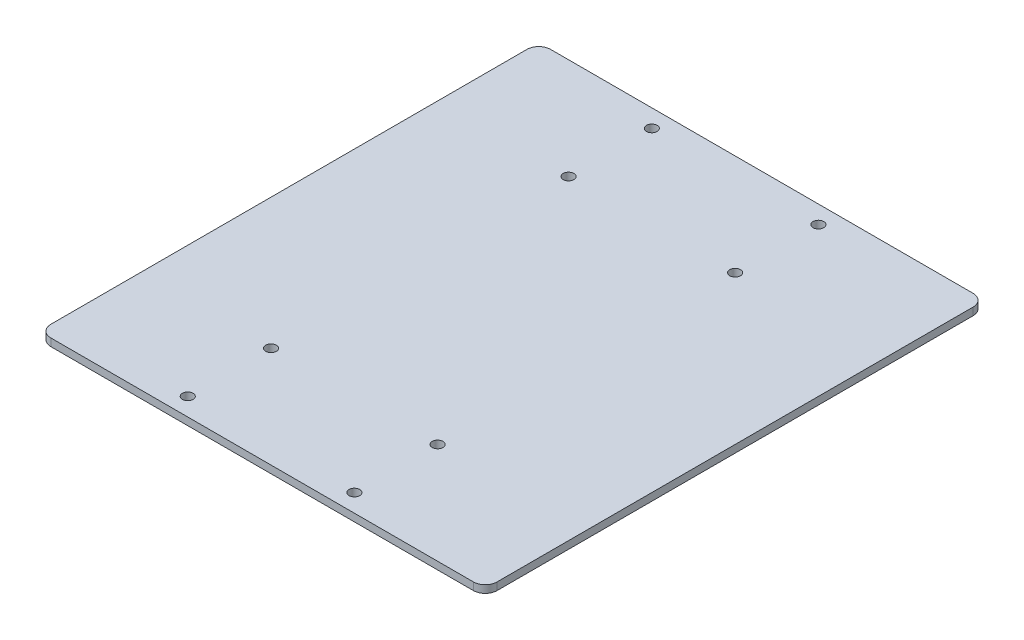
ISO-10303-21;
HEADER;
FILE_DESCRIPTION(('STEP AP214'),'2;1');
FILE_NAME('part.step','',(''),(''),'','','');
FILE_SCHEMA(('AUTOMOTIVE_DESIGN { 1 0 10303 214 1 1 1 1 }'));
ENDSEC;
DATA;
#1=APPLICATION_CONTEXT('core data for automotive mechanical design processes');
#2=APPLICATION_PROTOCOL_DEFINITION('international standard','automotive_design',2000,#1);
#3=PRODUCT_CONTEXT('',#1,'mechanical');
#4=PRODUCT('Part','Part','',(#3));
#5=PRODUCT_RELATED_PRODUCT_CATEGORY('part','',(#4));
#6=PRODUCT_DEFINITION_FORMATION('','',#4);
#7=PRODUCT_DEFINITION_CONTEXT('part definition',#1,'design');
#8=PRODUCT_DEFINITION('design','',#6,#7);
#9=PRODUCT_DEFINITION_SHAPE('','',#8);
#10=(LENGTH_UNIT() NAMED_UNIT(*) SI_UNIT(.MILLI.,.METRE.));
#11=(NAMED_UNIT(*) PLANE_ANGLE_UNIT() SI_UNIT($,.RADIAN.));
#12=(NAMED_UNIT(*) SI_UNIT($,.STERADIAN.) SOLID_ANGLE_UNIT());
#13=UNCERTAINTY_MEASURE_WITH_UNIT(LENGTH_MEASURE(1.E-05),#10,'distance_accuracy_value','');
#14=(GEOMETRIC_REPRESENTATION_CONTEXT(3) GLOBAL_UNCERTAINTY_ASSIGNED_CONTEXT((#13)) GLOBAL_UNIT_ASSIGNED_CONTEXT((#10,
#11,#12)) REPRESENTATION_CONTEXT('',''));
#15=CARTESIAN_POINT('',(0.,0.,0.));
#16=DIRECTION('',(0.,0.,1.));
#17=DIRECTION('',(1.,0.,0.));
#18=AXIS2_PLACEMENT_3D('',#15,#16,#17);
#19=CARTESIAN_POINT('',(0.,0.,0.));
#20=DIRECTION('',(0.,-1.,0.));
#21=DIRECTION('',(0.,0.,-1.));
#22=AXIS2_PLACEMENT_3D('',#19,#20,#21);
#23=PLANE('',#22);
#24=CARTESIAN_POINT('',(62.4999999999999,0.,-125.));
#25=DIRECTION('',(0.,1.,0.));
#26=DIRECTION('',(0.,0.,1.));
#27=AXIS2_PLACEMENT_3D('',#24,#25,#26);
#28=CIRCLE('',#27,4.5);
#29=CARTESIAN_POINT('',(62.4999999999999,0.,-120.5));
#30=VERTEX_POINT('',#29);
#31=EDGE_CURVE('E216',#30,#30,#28,.T.);
#32=ORIENTED_EDGE('',*,*,#31,.T.);
#33=EDGE_LOOP('',(#32));
#34=FACE_BOUND('',#33,.T.);
#35=CARTESIAN_POINT('',(62.4999999999999,0.,-195.));
#36=DIRECTION('',(0.,1.,0.));
#37=DIRECTION('',(0.,0.,1.));
#38=AXIS2_PLACEMENT_3D('',#35,#36,#37);
#39=CIRCLE('',#38,4.5);
#40=CARTESIAN_POINT('',(62.4999999999999,0.,-190.5));
#41=VERTEX_POINT('',#40);
#42=EDGE_CURVE('E204',#41,#41,#39,.T.);
#43=ORIENTED_EDGE('',*,*,#42,.T.);
#44=EDGE_LOOP('',(#43));
#45=FACE_BOUND('',#44,.T.);
#46=CARTESIAN_POINT('',(-77.5000000000001,0.,195.));
#47=DIRECTION('',(0.,1.,0.));
#48=DIRECTION('',(0.,0.,1.));
#49=AXIS2_PLACEMENT_3D('',#46,#47,#48);
#50=CIRCLE('',#49,4.5);
#51=CARTESIAN_POINT('',(-77.5000000000001,0.,199.5));
#52=VERTEX_POINT('',#51);
#53=EDGE_CURVE('E198',#52,#52,#50,.T.);
#54=ORIENTED_EDGE('',*,*,#53,.T.);
#55=EDGE_LOOP('',(#54));
#56=FACE_BOUND('',#55,.T.);
#57=CARTESIAN_POINT('',(62.4999999999999,0.,125.));
#58=DIRECTION('',(0.,1.,0.));
#59=DIRECTION('',(0.,0.,1.));
#60=AXIS2_PLACEMENT_3D('',#57,#58,#59);
#61=CIRCLE('',#60,4.5);
#62=CARTESIAN_POINT('',(62.4999999999999,0.,129.5));
#63=VERTEX_POINT('',#62);
#64=EDGE_CURVE('E192',#63,#63,#61,.T.);
#65=ORIENTED_EDGE('',*,*,#64,.T.);
#66=EDGE_LOOP('',(#65));
#67=FACE_BOUND('',#66,.T.);
#68=CARTESIAN_POINT('',(-77.5000000000001,0.,125.));
#69=DIRECTION('',(0.,1.,0.));
#70=DIRECTION('',(0.,0.,1.));
#71=AXIS2_PLACEMENT_3D('',#68,#69,#70);
#72=CIRCLE('',#71,4.5);
#73=CARTESIAN_POINT('',(-77.5000000000001,0.,129.5));
#74=VERTEX_POINT('',#73);
#75=EDGE_CURVE('E183',#74,#74,#72,.T.);
#76=ORIENTED_EDGE('',*,*,#75,.T.);
#77=EDGE_LOOP('',(#76));
#78=FACE_BOUND('',#77,.T.);
#79=CARTESIAN_POINT('',(62.4999999999999,0.,195.));
#80=DIRECTION('',(0.,1.,0.));
#81=DIRECTION('',(0.,0.,1.));
#82=AXIS2_PLACEMENT_3D('',#79,#80,#81);
#83=CIRCLE('',#82,4.5);
#84=CARTESIAN_POINT('',(62.4999999999999,0.,199.5));
#85=VERTEX_POINT('',#84);
#86=EDGE_CURVE('E174',#85,#85,#83,.T.);
#87=ORIENTED_EDGE('',*,*,#86,.T.);
#88=EDGE_LOOP('',(#87));
#89=FACE_BOUND('',#88,.T.);
#90=DIRECTION('',(0.,0.,1.));
#91=VECTOR('',#90,1.);
#92=CARTESIAN_POINT('',(-187.5,0.,210.));
#93=LINE('',#92,#91);
#94=CARTESIAN_POINT('',(-187.5,0.,-200.));
#95=VERTEX_POINT('',#94);
#96=CARTESIAN_POINT('',(-187.5,0.,200.));
#97=VERTEX_POINT('',#96);
#98=EDGE_CURVE('E116',#95,#97,#93,.T.);
#99=ORIENTED_EDGE('',*,*,#98,.F.);
#100=CARTESIAN_POINT('',(-177.5,0.,-200.));
#101=DIRECTION('',(0.,-1.,0.));
#102=DIRECTION('',(0.,0.,-1.));
#103=AXIS2_PLACEMENT_3D('',#100,#101,#102);
#104=CIRCLE('',#103,10.);
#105=CARTESIAN_POINT('',(-177.5,0.,-210.));
#106=VERTEX_POINT('',#105);
#107=EDGE_CURVE('E99',#95,#106,#104,.T.);
#108=ORIENTED_EDGE('',*,*,#107,.T.);
#109=DIRECTION('',(-1.,0.,0.));
#110=VECTOR('',#109,1.);
#111=CARTESIAN_POINT('',(-187.5,0.,-210.));
#112=LINE('',#111,#110);
#113=CARTESIAN_POINT('',(177.5,0.,-210.));
#114=VERTEX_POINT('',#113);
#115=EDGE_CURVE('E125',#114,#106,#112,.T.);
#116=ORIENTED_EDGE('',*,*,#115,.F.);
#117=CARTESIAN_POINT('',(177.5,0.,-200.));
#118=DIRECTION('',(0.,-1.,0.));
#119=DIRECTION('',(0.,0.,-1.));
#120=AXIS2_PLACEMENT_3D('',#117,#118,#119);
#121=CIRCLE('',#120,10.);
#122=CARTESIAN_POINT('',(187.5,0.,-200.));
#123=VERTEX_POINT('',#122);
#124=EDGE_CURVE('E110',#114,#123,#121,.T.);
#125=ORIENTED_EDGE('',*,*,#124,.T.);
#126=DIRECTION('',(0.,0.,-1.));
#127=VECTOR('',#126,1.);
#128=CARTESIAN_POINT('',(187.5,0.,210.));
#129=LINE('',#128,#127);
#130=CARTESIAN_POINT('',(187.5,0.,200.));
#131=VERTEX_POINT('',#130);
#132=EDGE_CURVE('E129',#131,#123,#129,.T.);
#133=ORIENTED_EDGE('',*,*,#132,.F.);
#134=CARTESIAN_POINT('',(177.5,0.,200.));
#135=DIRECTION('',(0.,-1.,0.));
#136=DIRECTION('',(0.,0.,-1.));
#137=AXIS2_PLACEMENT_3D('',#134,#135,#136);
#138=CIRCLE('',#137,10.);
#139=CARTESIAN_POINT('',(177.5,0.,210.));
#140=VERTEX_POINT('',#139);
#141=EDGE_CURVE('E136',#131,#140,#138,.T.);
#142=ORIENTED_EDGE('',*,*,#141,.T.);
#143=DIRECTION('',(1.,0.,0.));
#144=VECTOR('',#143,1.);
#145=CARTESIAN_POINT('',(-187.5,0.,210.));
#146=LINE('',#145,#144);
#147=CARTESIAN_POINT('',(-177.5,0.,210.));
#148=VERTEX_POINT('',#147);
#149=EDGE_CURVE('E124',#148,#140,#146,.T.);
#150=ORIENTED_EDGE('',*,*,#149,.F.);
#151=CARTESIAN_POINT('',(-177.5,0.,200.));
#152=DIRECTION('',(0.,-1.,0.));
#153=DIRECTION('',(0.,0.,-1.));
#154=AXIS2_PLACEMENT_3D('',#151,#152,#153);
#155=CIRCLE('',#154,10.);
#156=EDGE_CURVE('E119',#148,#97,#155,.T.);
#157=ORIENTED_EDGE('',*,*,#156,.T.);
#158=EDGE_LOOP('',(#99,#108,#116,#125,#133,#142,#150,#157));
#159=FACE_BOUND('',#158,.T.);
#160=CARTESIAN_POINT('',(-77.5000000000001,0.,-125.));
#161=DIRECTION('',(0.,1.,0.));
#162=DIRECTION('',(0.,0.,1.));
#163=AXIS2_PLACEMENT_3D('',#160,#161,#162);
#164=CIRCLE('',#163,4.5);
#165=CARTESIAN_POINT('',(-77.5000000000001,0.,-120.5));
#166=VERTEX_POINT('',#165);
#167=EDGE_CURVE('E210',#166,#166,#164,.T.);
#168=ORIENTED_EDGE('',*,*,#167,.T.);
#169=EDGE_LOOP('',(#168));
#170=FACE_BOUND('',#169,.T.);
#171=CARTESIAN_POINT('',(-77.5000000000001,0.,-195.));
#172=DIRECTION('',(0.,1.,0.));
#173=DIRECTION('',(0.,0.,1.));
#174=AXIS2_PLACEMENT_3D('',#171,#172,#173);
#175=CIRCLE('',#174,4.5);
#176=CARTESIAN_POINT('',(-77.5000000000001,0.,-190.5));
#177=VERTEX_POINT('',#176);
#178=EDGE_CURVE('E222',#177,#177,#175,.T.);
#179=ORIENTED_EDGE('',*,*,#178,.T.);
#180=EDGE_LOOP('',(#179));
#181=FACE_BOUND('',#180,.T.);
#182=ADVANCED_FACE('F34',(#34,#45,#56,#67,#78,#89,#159,#170,#181),#23,.T.);
#183=CARTESIAN_POINT('',(0.,6.35,0.));
#184=DIRECTION('',(0.,-1.,0.));
#185=DIRECTION('',(0.,0.,-1.));
#186=AXIS2_PLACEMENT_3D('',#183,#184,#185);
#187=PLANE('',#186);
#188=CARTESIAN_POINT('',(62.4999999999999,6.35,-195.));
#189=DIRECTION('',(0.,1.,0.));
#190=DIRECTION('',(0.,0.,1.));
#191=AXIS2_PLACEMENT_3D('',#188,#189,#190);
#192=CIRCLE('',#191,4.49999999999999);
#193=CARTESIAN_POINT('',(62.4999999999999,6.35,-190.5));
#194=VERTEX_POINT('',#193);
#195=EDGE_CURVE('E207',#194,#194,#192,.T.);
#196=ORIENTED_EDGE('',*,*,#195,.F.);
#197=EDGE_LOOP('',(#196));
#198=FACE_BOUND('',#197,.T.);
#199=CARTESIAN_POINT('',(-77.5000000000001,6.35,195.));
#200=DIRECTION('',(0.,1.,0.));
#201=DIRECTION('',(0.,0.,1.));
#202=AXIS2_PLACEMENT_3D('',#199,#200,#201);
#203=CIRCLE('',#202,4.49999999999999);
#204=CARTESIAN_POINT('',(-77.5000000000001,6.35,199.5));
#205=VERTEX_POINT('',#204);
#206=EDGE_CURVE('E201',#205,#205,#203,.T.);
#207=ORIENTED_EDGE('',*,*,#206,.F.);
#208=EDGE_LOOP('',(#207));
#209=FACE_BOUND('',#208,.T.);
#210=CARTESIAN_POINT('',(62.4999999999999,6.35,125.));
#211=DIRECTION('',(0.,1.,0.));
#212=DIRECTION('',(0.,0.,1.));
#213=AXIS2_PLACEMENT_3D('',#210,#211,#212);
#214=CIRCLE('',#213,4.49999999999999);
#215=CARTESIAN_POINT('',(62.4999999999999,6.35,129.5));
#216=VERTEX_POINT('',#215);
#217=EDGE_CURVE('E195',#216,#216,#214,.T.);
#218=ORIENTED_EDGE('',*,*,#217,.F.);
#219=EDGE_LOOP('',(#218));
#220=FACE_BOUND('',#219,.T.);
#221=CARTESIAN_POINT('',(-77.5000000000001,6.35,125.));
#222=DIRECTION('',(0.,1.,0.));
#223=DIRECTION('',(0.,0.,1.));
#224=AXIS2_PLACEMENT_3D('',#221,#222,#223);
#225=CIRCLE('',#224,4.49999999999999);
#226=CARTESIAN_POINT('',(-77.5000000000001,6.35,129.5));
#227=VERTEX_POINT('',#226);
#228=EDGE_CURVE('E187',#227,#227,#225,.T.);
#229=ORIENTED_EDGE('',*,*,#228,.F.);
#230=EDGE_LOOP('',(#229));
#231=FACE_BOUND('',#230,.T.);
#232=CARTESIAN_POINT('',(62.4999999999999,6.35,195.));
#233=DIRECTION('',(0.,1.,0.));
#234=DIRECTION('',(0.,0.,1.));
#235=AXIS2_PLACEMENT_3D('',#232,#233,#234);
#236=CIRCLE('',#235,4.49999999999999);
#237=CARTESIAN_POINT('',(62.4999999999999,6.35,199.5));
#238=VERTEX_POINT('',#237);
#239=EDGE_CURVE('E179',#238,#238,#236,.T.);
#240=ORIENTED_EDGE('',*,*,#239,.F.);
#241=EDGE_LOOP('',(#240));
#242=FACE_BOUND('',#241,.T.);
#243=DIRECTION('',(-1.,0.,0.));
#244=VECTOR('',#243,1.);
#245=CARTESIAN_POINT('',(-187.5,6.35,-210.));
#246=LINE('',#245,#244);
#247=CARTESIAN_POINT('',(177.5,6.35,-210.));
#248=VERTEX_POINT('',#247);
#249=CARTESIAN_POINT('',(-177.5,6.35,-210.));
#250=VERTEX_POINT('',#249);
#251=EDGE_CURVE('E169',#248,#250,#246,.T.);
#252=ORIENTED_EDGE('',*,*,#251,.T.);
#253=CARTESIAN_POINT('',(-177.5,6.35,-200.));
#254=DIRECTION('',(0.,-1.,0.));
#255=DIRECTION('',(0.,0.,-1.));
#256=AXIS2_PLACEMENT_3D('',#253,#254,#255);
#257=CIRCLE('',#256,10.);
#258=CARTESIAN_POINT('',(-187.5,6.35,-200.));
#259=VERTEX_POINT('',#258);
#260=EDGE_CURVE('E147',#250,#259,#257,.F.);
#261=ORIENTED_EDGE('',*,*,#260,.T.);
#262=DIRECTION('',(0.,0.,1.));
#263=VECTOR('',#262,1.);
#264=CARTESIAN_POINT('',(-187.5,6.35,210.));
#265=LINE('',#264,#263);
#266=CARTESIAN_POINT('',(-187.5,6.35,200.));
#267=VERTEX_POINT('',#266);
#268=EDGE_CURVE('E118',#259,#267,#265,.T.);
#269=ORIENTED_EDGE('',*,*,#268,.T.);
#270=CARTESIAN_POINT('',(-177.5,6.35,200.));
#271=DIRECTION('',(0.,-1.,0.));
#272=DIRECTION('',(0.,0.,-1.));
#273=AXIS2_PLACEMENT_3D('',#270,#271,#272);
#274=CIRCLE('',#273,10.);
#275=CARTESIAN_POINT('',(-177.5,6.35,210.));
#276=VERTEX_POINT('',#275);
#277=EDGE_CURVE('E54',#267,#276,#274,.F.);
#278=ORIENTED_EDGE('',*,*,#277,.T.);
#279=DIRECTION('',(1.,0.,0.));
#280=VECTOR('',#279,1.);
#281=CARTESIAN_POINT('',(-187.5,6.35,210.));
#282=LINE('',#281,#280);
#283=CARTESIAN_POINT('',(177.5,6.35,210.));
#284=VERTEX_POINT('',#283);
#285=EDGE_CURVE('E133',#276,#284,#282,.T.);
#286=ORIENTED_EDGE('',*,*,#285,.T.);
#287=CARTESIAN_POINT('',(177.5,6.35,200.));
#288=DIRECTION('',(0.,-1.,0.));
#289=DIRECTION('',(0.,0.,-1.));
#290=AXIS2_PLACEMENT_3D('',#287,#288,#289);
#291=CIRCLE('',#290,10.);
#292=CARTESIAN_POINT('',(187.5,6.35,200.));
#293=VERTEX_POINT('',#292);
#294=EDGE_CURVE('E143',#284,#293,#291,.F.);
#295=ORIENTED_EDGE('',*,*,#294,.T.);
#296=DIRECTION('',(0.,0.,-1.));
#297=VECTOR('',#296,1.);
#298=CARTESIAN_POINT('',(187.5,6.35,210.));
#299=LINE('',#298,#297);
#300=CARTESIAN_POINT('',(187.5,6.35,-200.));
#301=VERTEX_POINT('',#300);
#302=EDGE_CURVE('E127',#293,#301,#299,.T.);
#303=ORIENTED_EDGE('',*,*,#302,.T.);
#304=CARTESIAN_POINT('',(177.5,6.35,-200.));
#305=DIRECTION('',(0.,-1.,0.));
#306=DIRECTION('',(0.,0.,-1.));
#307=AXIS2_PLACEMENT_3D('',#304,#305,#306);
#308=CIRCLE('',#307,10.);
#309=EDGE_CURVE('E145',#301,#248,#308,.F.);
#310=ORIENTED_EDGE('',*,*,#309,.T.);
#311=EDGE_LOOP('',(#252,#261,#269,#278,#286,#295,#303,#310));
#312=FACE_BOUND('',#311,.T.);
#313=CARTESIAN_POINT('',(-77.5000000000001,6.35,-125.));
#314=DIRECTION('',(0.,1.,0.));
#315=DIRECTION('',(0.,0.,1.));
#316=AXIS2_PLACEMENT_3D('',#313,#314,#315);
#317=CIRCLE('',#316,4.49999999999999);
#318=CARTESIAN_POINT('',(-77.5000000000001,6.35,-120.5));
#319=VERTEX_POINT('',#318);
#320=EDGE_CURVE('E213',#319,#319,#317,.T.);
#321=ORIENTED_EDGE('',*,*,#320,.F.);
#322=EDGE_LOOP('',(#321));
#323=FACE_BOUND('',#322,.T.);
#324=CARTESIAN_POINT('',(62.4999999999999,6.35,-125.));
#325=DIRECTION('',(0.,1.,0.));
#326=DIRECTION('',(0.,0.,1.));
#327=AXIS2_PLACEMENT_3D('',#324,#325,#326);
#328=CIRCLE('',#327,4.49999999999999);
#329=CARTESIAN_POINT('',(62.4999999999999,6.35,-120.5));
#330=VERTEX_POINT('',#329);
#331=EDGE_CURVE('E219',#330,#330,#328,.T.);
#332=ORIENTED_EDGE('',*,*,#331,.F.);
#333=EDGE_LOOP('',(#332));
#334=FACE_BOUND('',#333,.T.);
#335=CARTESIAN_POINT('',(-77.5000000000001,6.35,-195.));
#336=DIRECTION('',(0.,1.,0.));
#337=DIRECTION('',(0.,0.,1.));
#338=AXIS2_PLACEMENT_3D('',#335,#336,#337);
#339=CIRCLE('',#338,4.49999999999999);
#340=CARTESIAN_POINT('',(-77.5000000000001,6.35,-190.5));
#341=VERTEX_POINT('',#340);
#342=EDGE_CURVE('E225',#341,#341,#339,.T.);
#343=ORIENTED_EDGE('',*,*,#342,.F.);
#344=EDGE_LOOP('',(#343));
#345=FACE_BOUND('',#344,.T.);
#346=ADVANCED_FACE('F231',(#198,#209,#220,#231,#242,#312,#323,#334,#345),#187,.F.);
#347=CARTESIAN_POINT('',(187.5,6.35,210.));
#348=DIRECTION('',(-1.,0.,0.));
#349=DIRECTION('',(0.,0.,1.));
#350=AXIS2_PLACEMENT_3D('',#347,#348,#349);
#351=PLANE('',#350);
#352=ORIENTED_EDGE('',*,*,#132,.T.);
#353=DIRECTION('',(0.,-1.,0.));
#354=VECTOR('',#353,1.);
#355=CARTESIAN_POINT('',(187.5,6.35,-200.));
#356=LINE('',#355,#354);
#357=EDGE_CURVE('E152',#123,#301,#356,.F.);
#358=ORIENTED_EDGE('',*,*,#357,.T.);
#359=ORIENTED_EDGE('',*,*,#302,.F.);
#360=DIRECTION('',(0.,-1.,0.));
#361=VECTOR('',#360,1.);
#362=CARTESIAN_POINT('',(187.5,6.35,200.));
#363=LINE('',#362,#361);
#364=EDGE_CURVE('E149',#293,#131,#363,.T.);
#365=ORIENTED_EDGE('',*,*,#364,.T.);
#366=EDGE_LOOP('',(#352,#358,#359,#365));
#367=FACE_BOUND('',#366,.T.);
#368=ADVANCED_FACE('F165',(#367),#351,.F.);
#369=CARTESIAN_POINT('',(-187.5,6.35,-210.));
#370=DIRECTION('',(0.,0.,1.));
#371=DIRECTION('',(1.,0.,0.));
#372=AXIS2_PLACEMENT_3D('',#369,#370,#371);
#373=PLANE('',#372);
#374=ORIENTED_EDGE('',*,*,#115,.T.);
#375=DIRECTION('',(0.,-1.,0.));
#376=VECTOR('',#375,1.);
#377=CARTESIAN_POINT('',(-177.5,6.35,-210.));
#378=LINE('',#377,#376);
#379=EDGE_CURVE('E104',#106,#250,#378,.F.);
#380=ORIENTED_EDGE('',*,*,#379,.T.);
#381=ORIENTED_EDGE('',*,*,#251,.F.);
#382=DIRECTION('',(0.,-1.,0.));
#383=VECTOR('',#382,1.);
#384=CARTESIAN_POINT('',(177.5,6.35,-210.));
#385=LINE('',#384,#383);
#386=EDGE_CURVE('E109',#248,#114,#385,.T.);
#387=ORIENTED_EDGE('',*,*,#386,.T.);
#388=EDGE_LOOP('',(#374,#380,#381,#387));
#389=FACE_BOUND('',#388,.T.);
#390=ADVANCED_FACE('F239',(#389),#373,.F.);
#391=CARTESIAN_POINT('',(-187.5,6.35,210.));
#392=DIRECTION('',(1.,0.,0.));
#393=DIRECTION('',(0.,0.,-1.));
#394=AXIS2_PLACEMENT_3D('',#391,#392,#393);
#395=PLANE('',#394);
#396=ORIENTED_EDGE('',*,*,#268,.F.);
#397=DIRECTION('',(0.,-1.,0.));
#398=VECTOR('',#397,1.);
#399=CARTESIAN_POINT('',(-187.5,6.35,-200.));
#400=LINE('',#399,#398);
#401=EDGE_CURVE('E103',#259,#95,#400,.T.);
#402=ORIENTED_EDGE('',*,*,#401,.T.);
#403=ORIENTED_EDGE('',*,*,#98,.T.);
#404=DIRECTION('',(0.,-1.,0.));
#405=VECTOR('',#404,1.);
#406=CARTESIAN_POINT('',(-187.5,6.35,200.));
#407=LINE('',#406,#405);
#408=EDGE_CURVE('E120',#97,#267,#407,.F.);
#409=ORIENTED_EDGE('',*,*,#408,.T.);
#410=EDGE_LOOP('',(#396,#402,#403,#409));
#411=FACE_BOUND('',#410,.T.);
#412=ADVANCED_FACE('F115',(#411),#395,.F.);
#413=CARTESIAN_POINT('',(-187.5,6.35,210.));
#414=DIRECTION('',(0.,0.,-1.));
#415=DIRECTION('',(-1.,0.,0.));
#416=AXIS2_PLACEMENT_3D('',#413,#414,#415);
#417=PLANE('',#416);
#418=ORIENTED_EDGE('',*,*,#149,.T.);
#419=DIRECTION('',(0.,-1.,0.));
#420=VECTOR('',#419,1.);
#421=CARTESIAN_POINT('',(177.5,6.35,210.));
#422=LINE('',#421,#420);
#423=EDGE_CURVE('E11',#140,#284,#422,.F.);
#424=ORIENTED_EDGE('',*,*,#423,.T.);
#425=ORIENTED_EDGE('',*,*,#285,.F.);
#426=DIRECTION('',(0.,-1.,0.));
#427=VECTOR('',#426,1.);
#428=CARTESIAN_POINT('',(-177.5,6.35,210.));
#429=LINE('',#428,#427);
#430=EDGE_CURVE('E42',#276,#148,#429,.T.);
#431=ORIENTED_EDGE('',*,*,#430,.T.);
#432=EDGE_LOOP('',(#418,#424,#425,#431));
#433=FACE_BOUND('',#432,.T.);
#434=ADVANCED_FACE('F155',(#433),#417,.F.);
#435=CARTESIAN_POINT('',(-177.5,6.35,-200.));
#436=DIRECTION('',(0.,-1.,0.));
#437=DIRECTION('',(0.,0.,-1.));
#438=AXIS2_PLACEMENT_3D('',#435,#436,#437);
#439=CYLINDRICAL_SURFACE('',#438,10.);
#440=ORIENTED_EDGE('',*,*,#260,.F.);
#441=ORIENTED_EDGE('',*,*,#379,.F.);
#442=ORIENTED_EDGE('',*,*,#107,.F.);
#443=ORIENTED_EDGE('',*,*,#401,.F.);
#444=EDGE_LOOP('',(#440,#441,#442,#443));
#445=FACE_BOUND('',#444,.T.);
#446=ADVANCED_FACE('F102',(#445),#439,.T.);
#447=CARTESIAN_POINT('',(177.5,6.35,-200.));
#448=DIRECTION('',(0.,-1.,0.));
#449=DIRECTION('',(0.,0.,-1.));
#450=AXIS2_PLACEMENT_3D('',#447,#448,#449);
#451=CYLINDRICAL_SURFACE('',#450,10.);
#452=ORIENTED_EDGE('',*,*,#309,.F.);
#453=ORIENTED_EDGE('',*,*,#357,.F.);
#454=ORIENTED_EDGE('',*,*,#124,.F.);
#455=ORIENTED_EDGE('',*,*,#386,.F.);
#456=EDGE_LOOP('',(#452,#453,#454,#455));
#457=FACE_BOUND('',#456,.T.);
#458=ADVANCED_FACE('F258',(#457),#451,.T.);
#459=CARTESIAN_POINT('',(177.5,6.35,200.));
#460=DIRECTION('',(0.,-1.,0.));
#461=DIRECTION('',(0.,0.,-1.));
#462=AXIS2_PLACEMENT_3D('',#459,#460,#461);
#463=CYLINDRICAL_SURFACE('',#462,10.);
#464=ORIENTED_EDGE('',*,*,#294,.F.);
#465=ORIENTED_EDGE('',*,*,#423,.F.);
#466=ORIENTED_EDGE('',*,*,#141,.F.);
#467=ORIENTED_EDGE('',*,*,#364,.F.);
#468=EDGE_LOOP('',(#464,#465,#466,#467));
#469=FACE_BOUND('',#468,.T.);
#470=ADVANCED_FACE('F162',(#469),#463,.T.);
#471=CARTESIAN_POINT('',(-177.5,6.35,200.));
#472=DIRECTION('',(0.,-1.,0.));
#473=DIRECTION('',(0.,0.,-1.));
#474=AXIS2_PLACEMENT_3D('',#471,#472,#473);
#475=CYLINDRICAL_SURFACE('',#474,10.);
#476=ORIENTED_EDGE('',*,*,#277,.F.);
#477=ORIENTED_EDGE('',*,*,#408,.F.);
#478=ORIENTED_EDGE('',*,*,#156,.F.);
#479=ORIENTED_EDGE('',*,*,#430,.F.);
#480=EDGE_LOOP('',(#476,#477,#478,#479));
#481=FACE_BOUND('',#480,.T.);
#482=ADVANCED_FACE('F36',(#481),#475,.T.);
#483=CARTESIAN_POINT('',(62.4999999999999,6.35,195.));
#484=DIRECTION('',(0.,1.,0.));
#485=DIRECTION('',(0.,0.,1.));
#486=AXIS2_PLACEMENT_3D('',#483,#484,#485);
#487=CYLINDRICAL_SURFACE('',#486,4.5);
#488=ORIENTED_EDGE('',*,*,#86,.F.);
#489=EDGE_LOOP('',(#488));
#490=FACE_BOUND('',#489,.T.);
#491=ORIENTED_EDGE('',*,*,#239,.T.);
#492=EDGE_LOOP('',(#491));
#493=FACE_BOUND('',#492,.T.);
#494=ADVANCED_FACE('F246',(#490,#493),#487,.F.);
#495=CARTESIAN_POINT('',(-77.5000000000001,6.35,125.));
#496=DIRECTION('',(0.,1.,0.));
#497=DIRECTION('',(0.,0.,1.));
#498=AXIS2_PLACEMENT_3D('',#495,#496,#497);
#499=CYLINDRICAL_SURFACE('',#498,4.5);
#500=ORIENTED_EDGE('',*,*,#75,.F.);
#501=EDGE_LOOP('',(#500));
#502=FACE_BOUND('',#501,.T.);
#503=ORIENTED_EDGE('',*,*,#228,.T.);
#504=EDGE_LOOP('',(#503));
#505=FACE_BOUND('',#504,.T.);
#506=ADVANCED_FACE('F268',(#502,#505),#499,.F.);
#507=CARTESIAN_POINT('',(62.4999999999999,6.35,125.));
#508=DIRECTION('',(0.,1.,0.));
#509=DIRECTION('',(0.,0.,1.));
#510=AXIS2_PLACEMENT_3D('',#507,#508,#509);
#511=CYLINDRICAL_SURFACE('',#510,4.5);
#512=ORIENTED_EDGE('',*,*,#64,.F.);
#513=EDGE_LOOP('',(#512));
#514=FACE_BOUND('',#513,.T.);
#515=ORIENTED_EDGE('',*,*,#217,.T.);
#516=EDGE_LOOP('',(#515));
#517=FACE_BOUND('',#516,.T.);
#518=ADVANCED_FACE('F299',(#514,#517),#511,.F.);
#519=CARTESIAN_POINT('',(-77.5000000000001,6.35,195.));
#520=DIRECTION('',(0.,1.,0.));
#521=DIRECTION('',(0.,0.,1.));
#522=AXIS2_PLACEMENT_3D('',#519,#520,#521);
#523=CYLINDRICAL_SURFACE('',#522,4.5);
#524=ORIENTED_EDGE('',*,*,#53,.F.);
#525=EDGE_LOOP('',(#524));
#526=FACE_BOUND('',#525,.T.);
#527=ORIENTED_EDGE('',*,*,#206,.T.);
#528=EDGE_LOOP('',(#527));
#529=FACE_BOUND('',#528,.T.);
#530=ADVANCED_FACE('F295',(#526,#529),#523,.F.);
#531=CARTESIAN_POINT('',(62.4999999999999,6.35,-195.));
#532=DIRECTION('',(0.,1.,0.));
#533=DIRECTION('',(0.,0.,1.));
#534=AXIS2_PLACEMENT_3D('',#531,#532,#533);
#535=CYLINDRICAL_SURFACE('',#534,4.5);
#536=ORIENTED_EDGE('',*,*,#42,.F.);
#537=EDGE_LOOP('',(#536));
#538=FACE_BOUND('',#537,.T.);
#539=ORIENTED_EDGE('',*,*,#195,.T.);
#540=EDGE_LOOP('',(#539));
#541=FACE_BOUND('',#540,.T.);
#542=ADVANCED_FACE('F288',(#538,#541),#535,.F.);
#543=CARTESIAN_POINT('',(-77.5000000000001,6.35,-125.));
#544=DIRECTION('',(0.,1.,0.));
#545=DIRECTION('',(0.,0.,1.));
#546=AXIS2_PLACEMENT_3D('',#543,#544,#545);
#547=CYLINDRICAL_SURFACE('',#546,4.5);
#548=ORIENTED_EDGE('',*,*,#167,.F.);
#549=EDGE_LOOP('',(#548));
#550=FACE_BOUND('',#549,.T.);
#551=ORIENTED_EDGE('',*,*,#320,.T.);
#552=EDGE_LOOP('',(#551));
#553=FACE_BOUND('',#552,.T.);
#554=ADVANCED_FACE('F279',(#550,#553),#547,.F.);
#555=CARTESIAN_POINT('',(62.4999999999999,6.35,-125.));
#556=DIRECTION('',(0.,1.,0.));
#557=DIRECTION('',(0.,0.,1.));
#558=AXIS2_PLACEMENT_3D('',#555,#556,#557);
#559=CYLINDRICAL_SURFACE('',#558,4.5);
#560=ORIENTED_EDGE('',*,*,#31,.F.);
#561=EDGE_LOOP('',(#560));
#562=FACE_BOUND('',#561,.T.);
#563=ORIENTED_EDGE('',*,*,#331,.T.);
#564=EDGE_LOOP('',(#563));
#565=FACE_BOUND('',#564,.T.);
#566=ADVANCED_FACE('F277',(#562,#565),#559,.F.);
#567=CARTESIAN_POINT('',(-77.5000000000001,6.35,-195.));
#568=DIRECTION('',(0.,1.,0.));
#569=DIRECTION('',(0.,0.,1.));
#570=AXIS2_PLACEMENT_3D('',#567,#568,#569);
#571=CYLINDRICAL_SURFACE('',#570,4.5);
#572=ORIENTED_EDGE('',*,*,#178,.F.);
#573=EDGE_LOOP('',(#572));
#574=FACE_BOUND('',#573,.T.);
#575=ORIENTED_EDGE('',*,*,#342,.T.);
#576=EDGE_LOOP('',(#575));
#577=FACE_BOUND('',#576,.T.);
#578=ADVANCED_FACE('F229',(#574,#577),#571,.F.);
#579=CLOSED_SHELL('',(#182,#346,#368,#390,#412,#434,#446,#458,#470,#482,#494,#506,#518,#530,
#542,#554,#566,#578));
#580=MANIFOLD_SOLID_BREP('B2',#579);
#581=ADVANCED_BREP_SHAPE_REPRESENTATION('',(#18,#580),#14);
#582=SHAPE_DEFINITION_REPRESENTATION(#9,#581);
ENDSEC;
END-ISO-10303-21;
